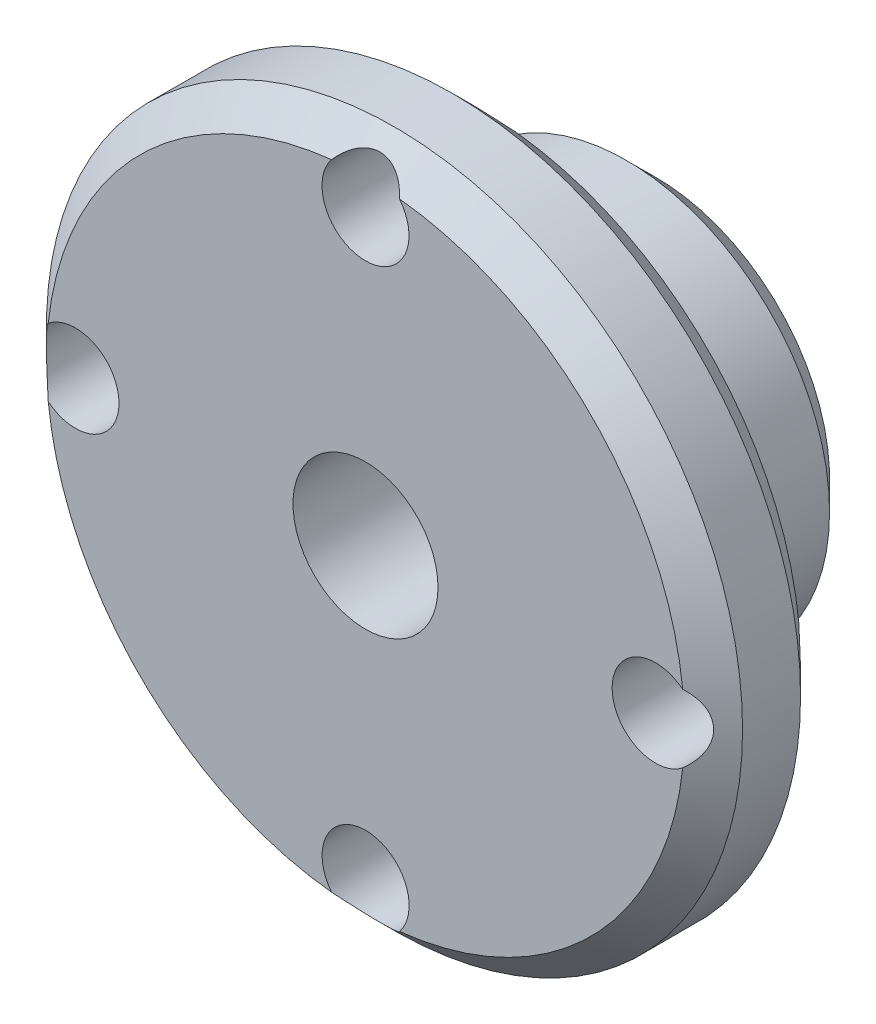
ISO-10303-21;
HEADER;
FILE_DESCRIPTION(('STEP AP214'),'2;1');
FILE_NAME('part.step','',(''),(''),'','','');
FILE_SCHEMA(('AUTOMOTIVE_DESIGN { 1 0 10303 214 1 1 1 1 }'));
ENDSEC;
DATA;
#1=APPLICATION_CONTEXT('core data for automotive mechanical design processes');
#2=APPLICATION_PROTOCOL_DEFINITION('international standard','automotive_design',2000,#1);
#3=PRODUCT_CONTEXT('',#1,'mechanical');
#4=PRODUCT('Part','Part','',(#3));
#5=PRODUCT_RELATED_PRODUCT_CATEGORY('part','',(#4));
#6=PRODUCT_DEFINITION_FORMATION('','',#4);
#7=PRODUCT_DEFINITION_CONTEXT('part definition',#1,'design');
#8=PRODUCT_DEFINITION('design','',#6,#7);
#9=PRODUCT_DEFINITION_SHAPE('','',#8);
#10=(LENGTH_UNIT() NAMED_UNIT(*) SI_UNIT(.MILLI.,.METRE.));
#11=(NAMED_UNIT(*) PLANE_ANGLE_UNIT() SI_UNIT($,.RADIAN.));
#12=(NAMED_UNIT(*) SI_UNIT($,.STERADIAN.) SOLID_ANGLE_UNIT());
#13=UNCERTAINTY_MEASURE_WITH_UNIT(LENGTH_MEASURE(1.E-05),#10,'distance_accuracy_value','');
#14=(GEOMETRIC_REPRESENTATION_CONTEXT(3) GLOBAL_UNCERTAINTY_ASSIGNED_CONTEXT((#13)) GLOBAL_UNIT_ASSIGNED_CONTEXT((#10,
#11,#12)) REPRESENTATION_CONTEXT('',''));
#15=CARTESIAN_POINT('',(0.,0.,0.));
#16=DIRECTION('',(0.,0.,1.));
#17=DIRECTION('',(1.,0.,0.));
#18=AXIS2_PLACEMENT_3D('',#15,#16,#17);
#19=CARTESIAN_POINT('',(0.,0.,2.));
#20=DIRECTION('',(0.,0.,-1.));
#21=DIRECTION('',(-1.,0.,0.));
#22=AXIS2_PLACEMENT_3D('',#19,#20,#21);
#23=CYLINDRICAL_SURFACE('',#22,6.);
#24=CARTESIAN_POINT('',(0.,0.,1.5));
#25=DIRECTION('',(0.,0.,1.));
#26=DIRECTION('',(1.,0.,0.));
#27=AXIS2_PLACEMENT_3D('',#24,#25,#26);
#28=CIRCLE('',#27,6.);
#29=CARTESIAN_POINT('',(6.,0.,1.5));
#30=VERTEX_POINT('',#29);
#31=EDGE_CURVE('E140',#30,#30,#28,.F.);
#32=ORIENTED_EDGE('',*,*,#31,.T.);
#33=EDGE_LOOP('',(#32));
#34=FACE_BOUND('',#33,.T.);
#35=CARTESIAN_POINT('',(0.,0.,0.500000000000009));
#36=DIRECTION('',(0.,0.,1.));
#37=DIRECTION('',(1.,0.,0.));
#38=AXIS2_PLACEMENT_3D('',#35,#36,#37);
#39=CIRCLE('',#38,6.);
#40=CARTESIAN_POINT('',(6.,0.,0.500000000000009));
#41=VERTEX_POINT('',#40);
#42=EDGE_CURVE('E135',#41,#41,#39,.T.);
#43=ORIENTED_EDGE('',*,*,#42,.T.);
#44=EDGE_LOOP('',(#43));
#45=FACE_BOUND('',#44,.T.);
#46=ADVANCED_FACE('F41',(#34,#45),#23,.T.);
#47=CARTESIAN_POINT('',(0.,0.,2.));
#48=DIRECTION('',(0.,0.,1.));
#49=DIRECTION('',(1.,0.,0.));
#50=AXIS2_PLACEMENT_3D('',#47,#48,#49);
#51=PLANE('',#50);
#52=CARTESIAN_POINT('',(0.,0.,2.));
#53=DIRECTION('',(0.,0.,1.));
#54=DIRECTION('',(1.,0.,0.));
#55=AXIS2_PLACEMENT_3D('',#52,#53,#54);
#56=CIRCLE('',#55,1.25);
#57=CARTESIAN_POINT('',(1.25,0.,2.));
#58=VERTEX_POINT('',#57);
#59=EDGE_CURVE('E334',#58,#58,#56,.T.);
#60=ORIENTED_EDGE('',*,*,#59,.F.);
#61=EDGE_LOOP('',(#60));
#62=FACE_BOUND('',#61,.T.);
#63=CARTESIAN_POINT('',(0.,5.,2.));
#64=DIRECTION('',(0.,0.,1.));
#65=DIRECTION('',(1.,0.,0.));
#66=AXIS2_PLACEMENT_3D('',#63,#64,#65);
#67=CIRCLE('',#66,0.75);
#68=CARTESIAN_POINT('',(-0.585468562349857,5.46874999999999,2.));
#69=VERTEX_POINT('',#68);
#70=CARTESIAN_POINT('',(0.585468562349857,5.46874999999999,2.));
#71=VERTEX_POINT('',#70);
#72=EDGE_CURVE('E115',#69,#71,#67,.T.);
#73=ORIENTED_EDGE('',*,*,#72,.F.);
#74=CARTESIAN_POINT('',(0.,0.,2.));
#75=DIRECTION('',(0.,0.,1.));
#76=DIRECTION('',(1.,0.,0.));
#77=AXIS2_PLACEMENT_3D('',#74,#75,#76);
#78=CIRCLE('',#77,5.49999999999999);
#79=CARTESIAN_POINT('',(-5.46896069157344,0.583497175678216,2.));
#80=VERTEX_POINT('',#79);
#81=EDGE_CURVE('E133',#69,#80,#78,.T.);
#82=ORIENTED_EDGE('',*,*,#81,.T.);
#83=CARTESIAN_POINT('',(-4.999,-0.00100000000000092,2.));
#84=DIRECTION('',(0.,0.,1.));
#85=DIRECTION('',(1.,0.,0.));
#86=AXIS2_PLACEMENT_3D('',#83,#84,#85);
#87=CIRCLE('',#86,0.75);
#88=CARTESIAN_POINT('',(-5.4687268083315,-0.585685150773218,2.));
#89=VERTEX_POINT('',#88);
#90=EDGE_CURVE('E325',#89,#80,#87,.T.);
#91=ORIENTED_EDGE('',*,*,#90,.F.);
#92=CARTESIAN_POINT('',(0.,0.,2.));
#93=DIRECTION('',(0.,0.,1.));
#94=DIRECTION('',(1.,0.,0.));
#95=AXIS2_PLACEMENT_3D('',#92,#93,#94);
#96=CIRCLE('',#95,5.49999999999999);
#97=CARTESIAN_POINT('',(-0.583281365982388,-5.46898371254638,2.));
#98=VERTEX_POINT('',#97);
#99=EDGE_CURVE('E319',#89,#98,#96,.T.);
#100=ORIENTED_EDGE('',*,*,#99,.T.);
#101=CARTESIAN_POINT('',(0.00200000000000061,-5.,2.));
#102=DIRECTION('',(0.,0.,1.));
#103=DIRECTION('',(1.,0.,0.));
#104=AXIS2_PLACEMENT_3D('',#101,#102,#103);
#105=CIRCLE('',#104,0.75);
#106=CARTESIAN_POINT('',(0.587656365602389,-5.46851533745375,2.));
#107=VERTEX_POINT('',#106);
#108=EDGE_CURVE('E328',#107,#98,#105,.T.);
#109=ORIENTED_EDGE('',*,*,#108,.F.);
#110=CARTESIAN_POINT('',(0.,0.,2.));
#111=DIRECTION('',(0.,0.,1.));
#112=DIRECTION('',(1.,0.,0.));
#113=AXIS2_PLACEMENT_3D('',#110,#111,#112);
#114=CIRCLE('',#113,5.49999999999999);
#115=CARTESIAN_POINT('',(5.46877349511244,-0.585249057372621,2.));
#116=VERTEX_POINT('',#115);
#117=EDGE_CURVE('E123',#107,#116,#114,.T.);
#118=ORIENTED_EDGE('',*,*,#117,.T.);
#119=CARTESIAN_POINT('',(5.001,0.00100000000000031,2.));
#120=DIRECTION('',(0.,0.,1.));
#121=DIRECTION('',(1.,0.,0.));
#122=AXIS2_PLACEMENT_3D('',#119,#120,#121);
#123=CIRCLE('',#122,0.749999999999998);
#124=CARTESIAN_POINT('',(5.4685390049825,0.587436082467621,2.));
#125=VERTEX_POINT('',#124);
#126=EDGE_CURVE('E118',#125,#116,#123,.T.);
#127=ORIENTED_EDGE('',*,*,#126,.F.);
#128=CARTESIAN_POINT('',(0.,0.,2.));
#129=DIRECTION('',(0.,0.,1.));
#130=DIRECTION('',(1.,0.,0.));
#131=AXIS2_PLACEMENT_3D('',#128,#129,#130);
#132=CIRCLE('',#131,5.49999999999999);
#133=EDGE_CURVE('E111',#125,#71,#132,.T.);
#134=ORIENTED_EDGE('',*,*,#133,.T.);
#135=EDGE_LOOP('',(#73,#82,#91,#100,#109,#118,#127,#134));
#136=FACE_BOUND('',#135,.T.);
#137=ADVANCED_FACE('F113',(#62,#136),#51,.T.);
#138=CARTESIAN_POINT('',(0.,0.,0.));
#139=DIRECTION('',(0.,0.,1.));
#140=DIRECTION('',(1.,0.,0.));
#141=AXIS2_PLACEMENT_3D('',#138,#139,#140);
#142=PLANE('',#141);
#143=CARTESIAN_POINT('',(0.00200000000000061,-5.,0.));
#144=DIRECTION('',(0.,0.,1.));
#145=DIRECTION('',(1.,0.,0.));
#146=AXIS2_PLACEMENT_3D('',#143,#144,#145);
#147=CIRCLE('',#146,0.75);
#148=CARTESIAN_POINT('',(0.587656365602385,-5.46851533745376,0.));
#149=VERTEX_POINT('',#148);
#150=CARTESIAN_POINT('',(-0.583281365982384,-5.46898371254639,0.));
#151=VERTEX_POINT('',#150);
#152=EDGE_CURVE('E308',#149,#151,#147,.T.);
#153=ORIENTED_EDGE('',*,*,#152,.T.);
#154=CARTESIAN_POINT('',(0.,0.,0.));
#155=DIRECTION('',(0.,0.,1.));
#156=DIRECTION('',(1.,0.,0.));
#157=AXIS2_PLACEMENT_3D('',#154,#155,#156);
#158=CIRCLE('',#157,5.5);
#159=CARTESIAN_POINT('',(-5.46872680833151,-0.585685150773214,0.));
#160=VERTEX_POINT('',#159);
#161=EDGE_CURVE('E277',#151,#160,#158,.F.);
#162=ORIENTED_EDGE('',*,*,#161,.T.);
#163=CARTESIAN_POINT('',(-4.999,-0.00100000000000092,0.));
#164=DIRECTION('',(0.,0.,1.));
#165=DIRECTION('',(1.,0.,0.));
#166=AXIS2_PLACEMENT_3D('',#163,#164,#165);
#167=CIRCLE('',#166,0.75);
#168=CARTESIAN_POINT('',(-5.46896069157345,0.583497175678212,0.));
#169=VERTEX_POINT('',#168);
#170=EDGE_CURVE('E130',#160,#169,#167,.T.);
#171=ORIENTED_EDGE('',*,*,#170,.T.);
#172=CARTESIAN_POINT('',(0.,0.,0.));
#173=DIRECTION('',(0.,0.,1.));
#174=DIRECTION('',(1.,0.,0.));
#175=AXIS2_PLACEMENT_3D('',#172,#173,#174);
#176=CIRCLE('',#175,5.5);
#177=CARTESIAN_POINT('',(-0.585468562349852,5.46875,0.));
#178=VERTEX_POINT('',#177);
#179=EDGE_CURVE('E59',#169,#178,#176,.F.);
#180=ORIENTED_EDGE('',*,*,#179,.T.);
#181=CARTESIAN_POINT('',(0.,5.,0.));
#182=DIRECTION('',(0.,0.,1.));
#183=DIRECTION('',(1.,0.,0.));
#184=AXIS2_PLACEMENT_3D('',#181,#182,#183);
#185=CIRCLE('',#184,0.75);
#186=CARTESIAN_POINT('',(0.585468562349852,5.46875,0.));
#187=VERTEX_POINT('',#186);
#188=EDGE_CURVE('E315',#178,#187,#185,.T.);
#189=ORIENTED_EDGE('',*,*,#188,.T.);
#190=CARTESIAN_POINT('',(0.,0.,0.));
#191=DIRECTION('',(0.,0.,1.));
#192=DIRECTION('',(1.,0.,0.));
#193=AXIS2_PLACEMENT_3D('',#190,#191,#192);
#194=CIRCLE('',#193,5.5);
#195=CARTESIAN_POINT('',(5.46853900498251,0.587436082467617,0.));
#196=VERTEX_POINT('',#195);
#197=EDGE_CURVE('E270',#187,#196,#194,.F.);
#198=ORIENTED_EDGE('',*,*,#197,.T.);
#199=CARTESIAN_POINT('',(5.001,0.00100000000000031,0.));
#200=DIRECTION('',(0.,0.,1.));
#201=DIRECTION('',(1.,0.,0.));
#202=AXIS2_PLACEMENT_3D('',#199,#200,#201);
#203=CIRCLE('',#202,0.749999999999998);
#204=CARTESIAN_POINT('',(5.46877349511245,-0.585249057372616,0.));
#205=VERTEX_POINT('',#204);
#206=EDGE_CURVE('E312',#196,#205,#203,.T.);
#207=ORIENTED_EDGE('',*,*,#206,.T.);
#208=CARTESIAN_POINT('',(0.,0.,0.));
#209=DIRECTION('',(0.,0.,1.));
#210=DIRECTION('',(1.,0.,0.));
#211=AXIS2_PLACEMENT_3D('',#208,#209,#210);
#212=CIRCLE('',#211,5.5);
#213=EDGE_CURVE('E268',#205,#149,#212,.F.);
#214=ORIENTED_EDGE('',*,*,#213,.T.);
#215=EDGE_LOOP('',(#153,#162,#171,#180,#189,#198,#207,#214));
#216=FACE_BOUND('',#215,.T.);
#217=CARTESIAN_POINT('',(0.,0.,0.));
#218=DIRECTION('',(0.,0.,1.));
#219=DIRECTION('',(1.,0.,0.));
#220=AXIS2_PLACEMENT_3D('',#217,#218,#219);
#221=CIRCLE('',#220,3.5);
#222=CARTESIAN_POINT('',(3.5,0.,0.));
#223=VERTEX_POINT('',#222);
#224=EDGE_CURVE('E124',#223,#223,#221,.F.);
#225=ORIENTED_EDGE('',*,*,#224,.F.);
#226=EDGE_LOOP('',(#225));
#227=FACE_BOUND('',#226,.T.);
#228=ADVANCED_FACE('F248',(#216,#227),#142,.F.);
#229=CARTESIAN_POINT('',(0.,0.,-3.));
#230=DIRECTION('',(0.,0.,-1.));
#231=DIRECTION('',(-1.,0.,0.));
#232=AXIS2_PLACEMENT_3D('',#229,#230,#231);
#233=PLANE('',#232);
#234=CARTESIAN_POINT('',(0.,0.,-3.));
#235=DIRECTION('',(0.,0.,-1.));
#236=DIRECTION('',(-1.,0.,0.));
#237=AXIS2_PLACEMENT_3D('',#234,#235,#236);
#238=CIRCLE('',#237,3.);
#239=CARTESIAN_POINT('',(-3.,0.,-3.));
#240=VERTEX_POINT('',#239);
#241=EDGE_CURVE('E52',#240,#240,#238,.T.);
#242=ORIENTED_EDGE('',*,*,#241,.T.);
#243=EDGE_LOOP('',(#242));
#244=FACE_BOUND('',#243,.T.);
#245=CARTESIAN_POINT('',(0.,0.,-3.));
#246=DIRECTION('',(0.,0.,-1.));
#247=DIRECTION('',(-1.,0.,0.));
#248=AXIS2_PLACEMENT_3D('',#245,#246,#247);
#249=CIRCLE('',#248,2.5);
#250=CARTESIAN_POINT('',(-2.5,0.,-3.));
#251=VERTEX_POINT('',#250);
#252=EDGE_CURVE('E298',#251,#251,#249,.T.);
#253=ORIENTED_EDGE('',*,*,#252,.F.);
#254=EDGE_LOOP('',(#253));
#255=FACE_BOUND('',#254,.T.);
#256=ADVANCED_FACE('F245',(#244,#255),#233,.T.);
#257=CARTESIAN_POINT('',(0.,0.,-3.));
#258=DIRECTION('',(0.,0.,1.));
#259=DIRECTION('',(1.,0.,0.));
#260=AXIS2_PLACEMENT_3D('',#257,#258,#259);
#261=CYLINDRICAL_SURFACE('',#260,3.5);
#262=CARTESIAN_POINT('',(0.,0.,-2.5));
#263=DIRECTION('',(0.,0.,-1.));
#264=DIRECTION('',(-1.,0.,0.));
#265=AXIS2_PLACEMENT_3D('',#262,#263,#264);
#266=CIRCLE('',#265,3.5);
#267=CARTESIAN_POINT('',(-3.5,0.,-2.5));
#268=VERTEX_POINT('',#267);
#269=EDGE_CURVE('E11',#268,#268,#266,.F.);
#270=ORIENTED_EDGE('',*,*,#269,.T.);
#271=EDGE_LOOP('',(#270));
#272=FACE_BOUND('',#271,.T.);
#273=ORIENTED_EDGE('',*,*,#224,.T.);
#274=EDGE_LOOP('',(#273));
#275=FACE_BOUND('',#274,.T.);
#276=ADVANCED_FACE('F243',(#272,#275),#261,.T.);
#277=CARTESIAN_POINT('',(0.,0.,-3.));
#278=DIRECTION('',(0.,0.,1.));
#279=DIRECTION('',(1.,0.,0.));
#280=AXIS2_PLACEMENT_3D('',#277,#278,#279);
#281=CYLINDRICAL_SURFACE('',#280,2.5);
#282=ORIENTED_EDGE('',*,*,#252,.T.);
#283=EDGE_LOOP('',(#282));
#284=FACE_BOUND('',#283,.T.);
#285=CARTESIAN_POINT('',(0.,0.,0.));
#286=DIRECTION('',(0.,0.,-1.));
#287=DIRECTION('',(-1.,0.,0.));
#288=AXIS2_PLACEMENT_3D('',#285,#286,#287);
#289=CIRCLE('',#288,2.5);
#290=CARTESIAN_POINT('',(-2.5,0.,0.));
#291=VERTEX_POINT('',#290);
#292=EDGE_CURVE('E302',#291,#291,#289,.T.);
#293=ORIENTED_EDGE('',*,*,#292,.F.);
#294=EDGE_LOOP('',(#293));
#295=FACE_BOUND('',#294,.T.);
#296=ADVANCED_FACE('F239',(#284,#295),#281,.F.);
#297=CARTESIAN_POINT('',(0.,0.,0.));
#298=DIRECTION('',(0.,0.,1.));
#299=DIRECTION('',(1.,0.,0.));
#300=AXIS2_PLACEMENT_3D('',#297,#298,#299);
#301=CIRCLE('',#300,1.25);
#302=CARTESIAN_POINT('',(1.25,0.,0.));
#303=VERTEX_POINT('',#302);
#304=EDGE_CURVE('E46',#303,#303,#301,.T.);
#305=ORIENTED_EDGE('',*,*,#304,.T.);
#306=EDGE_LOOP('',(#305));
#307=FACE_BOUND('',#306,.T.);
#308=ORIENTED_EDGE('',*,*,#292,.T.);
#309=EDGE_LOOP('',(#308));
#310=FACE_BOUND('',#309,.T.);
#311=ADVANCED_FACE('F237',(#307,#310),#142,.F.);
#312=CARTESIAN_POINT('',(-4.999,-0.00100000000000092,-0.5));
#313=DIRECTION('',(0.,0.,1.));
#314=DIRECTION('',(1.,0.,0.));
#315=AXIS2_PLACEMENT_3D('',#312,#313,#314);
#316=CYLINDRICAL_SURFACE('',#315,0.75);
#317=ORIENTED_EDGE('',*,*,#90,.T.);
#318=CARTESIAN_POINT('',(-5.46896069157344,0.583497175678217,2.));
#319=CARTESIAN_POINT('',(-5.49813523976206,0.560055866293659,1.97347212423594));
#320=CARTESIAN_POINT('',(-5.52632403204126,0.533773451639623,1.94804512230684));
#321=CARTESIAN_POINT('',(-5.57963483606504,0.475377972943608,1.90024161593699));
#322=CARTESIAN_POINT('',(-5.60473095774736,0.443220636313701,1.87789070220826));
#323=CARTESIAN_POINT('',(-5.64587236280918,0.380036987407392,1.84142776428044));
#324=CARTESIAN_POINT('',(-5.66272980915366,0.349987413694403,1.82655808838139));
#325=CARTESIAN_POINT('',(-5.69252038668611,0.286661100317775,1.80035841040929));
#326=CARTESIAN_POINT('',(-5.70546458904823,0.253393823285079,1.7890184195651));
#327=CARTESIAN_POINT('',(-5.72674391670884,0.183976212467005,1.77040974897053));
#328=CARTESIAN_POINT('',(-5.7350391008631,0.14780385848315,1.76317634348414));
#329=CARTESIAN_POINT('',(-5.74617294469064,0.073986287164703,1.75346957768339));
#330=CARTESIAN_POINT('',(-5.74901244326423,0.0363412971803144,1.75099548554719));
#331=CARTESIAN_POINT('',(-5.74898903291236,-0.0341396487115576,1.75100377470086));
#332=CARTESIAN_POINT('',(-5.74680467947558,-0.0669790346449679,1.7528964598955));
#333=CARTESIAN_POINT('',(-5.73824934907375,-0.131668661613688,1.76033171571431));
#334=CARTESIAN_POINT('',(-5.73187949430698,-0.163519165387272,1.76587330801033));
#335=CARTESIAN_POINT('',(-5.715454494151,-0.225044035969612,1.78019999798305));
#336=CARTESIAN_POINT('',(-5.70544420575685,-0.254739825395197,1.78894562522744));
#337=CARTESIAN_POINT('',(-5.68225273837935,-0.311832938776229,1.80927177792872));
#338=CARTESIAN_POINT('',(-5.66906914620723,-0.339228491991636,1.82085446098795));
#339=CARTESIAN_POINT('',(-5.63453054441123,-0.401377851922976,1.85131445244515));
#340=CARTESIAN_POINT('',(-5.61197965905399,-0.434932027085068,1.87128664085739));
#341=CARTESIAN_POINT('',(-5.56325022538985,-0.496653797139724,1.91472142454721));
#342=CARTESIAN_POINT('',(-5.53706966303735,-0.524818380643924,1.93818595820261));
#343=CARTESIAN_POINT('',(-5.49627445326811,-0.562738398443341,1.9750090721431));
#344=CARTESIAN_POINT('',(-5.48261748274028,-0.574524941218416,1.98737588339054));
#345=CARTESIAN_POINT('',(-5.46872680833151,-0.585685150773223,2.));
#346=B_SPLINE_CURVE_WITH_KNOTS('',3,(#318,#319,#320,#321,#322,#323,#324,#325,#326,#327,#328,
#329,#330,#331,#332,#333,#334,#335,#336,#337,#338,#339,#340,#341,#342,#343,#344,#345),
.UNSPECIFIED.,.F.,.F.,(4,2,2,2,2,2,2,2,2,2,2,2,2,4),(0.,0.137812042013505,0.276709001346447,
0.388833373901599,0.500637494884642,0.613387986210475,0.726121138928019,0.824533831482315,
0.922920148817424,1.02013310483008,1.11742022283566,1.25196271149929,1.38658015652701,
1.4521293583338),.UNSPECIFIED.);
#347=EDGE_CURVE('E199',#80,#89,#346,.T.);
#348=ORIENTED_EDGE('',*,*,#347,.T.);
#349=EDGE_LOOP('',(#317,#348));
#350=FACE_BOUND('',#349,.T.);
#351=ORIENTED_EDGE('',*,*,#170,.F.);
#352=CARTESIAN_POINT('',(-5.46872680833151,-0.585685150773214,0.));
#353=CARTESIAN_POINT('',(-5.49791073258428,-0.56225551541795,0.0265278757640543));
#354=CARTESIAN_POINT('',(-5.52611003767593,-0.535984380639364,0.0519548776931643));
#355=CARTESIAN_POINT('',(-5.57944420029626,-0.477610235203329,0.0997583840630121));
#356=CARTESIAN_POINT('',(-5.60455318547733,-0.445462941603401,0.122109297791739));
#357=CARTESIAN_POINT('',(-5.64571986576077,-0.382295757607144,0.158572235719565));
#358=CARTESIAN_POINT('',(-5.66258933298957,-0.352252930626215,0.173441911618606));
#359=CARTESIAN_POINT('',(-5.69240524372927,-0.288938540931979,0.199641589590713));
#360=CARTESIAN_POINT('',(-5.70536275462763,-0.255676445278211,0.210981580434903));
#361=CARTESIAN_POINT('',(-5.72666985318295,-0.186267353449179,0.229590251029466));
#362=CARTESIAN_POINT('',(-5.73497950850871,-0.150098321097547,0.236823656515859));
#363=CARTESIAN_POINT('',(-5.74614288437912,-0.0762852101151067,0.246530422316612));
#364=CARTESIAN_POINT('',(-5.74899744373305,-0.0386413591701116,0.249004514452814));
#365=CARTESIAN_POINT('',(-5.74900223139989,0.031839590447042,0.248996225299137));
#366=CARTESIAN_POINT('',(-5.74683101651945,0.0646798476683729,0.247103540104502));
#367=CARTESIAN_POINT('',(-5.73830156782828,0.129372892276439,0.239668284285695));
#368=CARTESIAN_POINT('',(-5.73194445632085,0.161225941952457,0.234126691989668));
#369=CARTESIAN_POINT('',(-5.71554407234962,0.222757378924901,0.219800002016951));
#370=CARTESIAN_POINT('',(-5.70554566544804,0.252457170890052,0.211054374772559));
#371=CARTESIAN_POINT('',(-5.68237704173941,0.309559558144076,0.190728222071278));
#372=CARTESIAN_POINT('',(-5.66920441103532,0.336960383658518,0.179145539012048));
#373=CARTESIAN_POINT('',(-5.63469067671944,0.399123556819725,0.148685547554845));
#374=CARTESIAN_POINT('',(-5.6121532175214,0.432686751454624,0.128713359142612));
#375=CARTESIAN_POINT('',(-5.56344848140293,0.494428012241382,0.0852785754527886));
#376=CARTESIAN_POINT('',(-5.53727918923228,0.522603067810899,0.0618140417973851));
#377=CARTESIAN_POINT('',(-5.49649915376868,0.560539403923025,0.0249909278568973));
#378=CARTESIAN_POINT('',(-5.48284689989388,0.572331409635567,0.0126241166094625));
#379=CARTESIAN_POINT('',(-5.46896069157345,0.583497175678217,0.));
#380=B_SPLINE_CURVE_WITH_KNOTS('',3,(#352,#353,#354,#355,#356,#357,#358,#359,#360,#361,#362,
#363,#364,#365,#366,#367,#368,#369,#370,#371,#372,#373,#374,#375,#376,#377,#378,#379),
.UNSPECIFIED.,.F.,.F.,(4,2,2,2,2,2,2,2,2,2,2,2,2,4),(0.,0.137812042013504,0.276709001346445,
0.388833373901596,0.500637494884638,0.613387986210471,0.726121138928014,0.824533831482309,
0.922920148817417,1.02013310483007,1.11742022283565,1.25196271149928,1.386580156527,
1.45212935833379),.UNSPECIFIED.);
#381=EDGE_CURVE('E224',#160,#169,#380,.T.);
#382=ORIENTED_EDGE('',*,*,#381,.T.);
#383=EDGE_LOOP('',(#351,#382));
#384=FACE_BOUND('',#383,.T.);
#385=ADVANCED_FACE('F233',(#350,#384),#316,.F.);
#386=CARTESIAN_POINT('',(0.00200000000000061,-5.,-0.5));
#387=DIRECTION('',(0.,0.,1.));
#388=DIRECTION('',(1.,0.,0.));
#389=AXIS2_PLACEMENT_3D('',#386,#387,#388);
#390=CYLINDRICAL_SURFACE('',#389,0.75);
#391=ORIENTED_EDGE('',*,*,#108,.T.);
#392=CARTESIAN_POINT('',(-0.583281365982388,-5.46898371254638,2.));
#393=CARTESIAN_POINT('',(-0.559861842850771,-5.49823082991975,1.97339653558816));
#394=CARTESIAN_POINT('',(-0.53359371639693,-5.52649431042915,1.94789288943749));
#395=CARTESIAN_POINT('',(-0.475208295516312,-5.57995593389168,1.899936101339));
#396=CARTESIAN_POINT('',(-0.443046497924076,-5.60512813931582,1.8775086082033));
#397=CARTESIAN_POINT('',(-0.379859882677926,-5.64638762789034,1.84092549057404));
#398=CARTESIAN_POINT('',(-0.349818808290455,-5.66329036623299,1.82600897871863));
#399=CARTESIAN_POINT('',(-0.286499261395131,-5.69317297208004,1.7997147706667));
#400=CARTESIAN_POINT('',(-0.253230281783379,-5.70616390750878,1.78832708740856));
#401=CARTESIAN_POINT('',(-0.183795824998775,-5.72753621456721,1.76962369652555));
#402=CARTESIAN_POINT('',(-0.147608140770413,-5.73587748597438,1.76234340608831));
#403=CARTESIAN_POINT('',(-0.0737470806957188,-5.74709757301578,1.75254822108865));
#404=CARTESIAN_POINT('',(-0.0360739456764005,-5.74997727041474,1.75003255728293));
#405=CARTESIAN_POINT('',(0.0344534917571341,-5.7500196227503,1.74997139049168));
#406=CARTESIAN_POINT('',(0.0673100148696411,-5.74786413405875,1.7518333074522));
#407=CARTESIAN_POINT('',(0.132039927378482,-5.73936093308324,1.75921199064719));
#408=CARTESIAN_POINT('',(0.163913576613288,-5.73301433890466,1.76472778210027));
#409=CARTESIAN_POINT('',(0.225467168250005,-5.71663452042586,1.77900422783914));
#410=CARTESIAN_POINT('',(0.255169672202564,-5.7066487029983,1.78772316713297));
#411=CARTESIAN_POINT('',(0.312279925751162,-5.68350400555447,1.80799790925589));
#412=CARTESIAN_POINT('',(0.339685942926989,-5.67034275858543,1.81955582836614));
#413=CARTESIAN_POINT('',(0.401840352262842,-5.63586711130483,1.84994829954424));
#414=CARTESIAN_POINT('',(0.435393693385007,-5.61335883814335,1.86987587416029));
#415=CARTESIAN_POINT('',(0.497124991494282,-5.56471291601569,1.91322262725754));
#416=CARTESIAN_POINT('',(0.52529962253938,-5.53857303858279,1.93664395026817));
#417=CARTESIAN_POINT('',(0.56378062546011,-5.49725596918552,1.97392790527326));
#418=CARTESIAN_POINT('',(0.576058701035818,-5.48301178453495,1.98682475350991));
#419=CARTESIAN_POINT('',(0.587656365602396,-5.46851533745375,2.));
#420=B_SPLINE_CURVE_WITH_KNOTS('',3,(#392,#393,#394,#395,#396,#397,#398,#399,#400,#401,#402,
#403,#404,#405,#406,#407,#408,#409,#410,#411,#412,#413,#414,#415,#416,#417,#418,#419),
.UNSPECIFIED.,.F.,.F.,(4,2,2,2,2,2,2,2,2,2,2,2,2,4),(0.,0.138049427337773,0.277187771935965,
0.389408521259783,0.501308707225072,0.614159589214158,0.726992250009187,0.825444485962202,
0.923870467379601,1.02105761849111,1.11831743755888,1.25273510423627,1.38723562116601,
1.45556985611542),.UNSPECIFIED.);
#421=EDGE_CURVE('E187',#98,#107,#420,.T.);
#422=ORIENTED_EDGE('',*,*,#421,.T.);
#423=EDGE_LOOP('',(#391,#422));
#424=FACE_BOUND('',#423,.T.);
#425=ORIENTED_EDGE('',*,*,#152,.F.);
#426=CARTESIAN_POINT('',(0.587656365602385,-5.46851533745376,0.));
#427=CARTESIAN_POINT('',(0.564260247655169,-5.49778118108356,0.0266034644118449));
#428=CARTESIAN_POINT('',(0.538014740387917,-5.52606566704644,0.0521071105625078));
#429=CARTESIAN_POINT('',(0.479672107482557,-5.57957398173048,0.100063898661002));
#430=CARTESIAN_POINT('',(0.447530457943212,-5.60477190853348,0.122491391796698));
#431=CARTESIAN_POINT('',(0.384376870502354,-5.64608193318907,0.159074509425957));
#432=CARTESIAN_POINT('',(0.354349327916536,-5.66300869897851,0.173991021281372));
#433=CARTESIAN_POINT('',(0.291053707364317,-5.69294195089254,0.200285229333299));
#434=CARTESIAN_POINT('',(0.257795131145317,-5.70595949734361,0.21167291259144));
#435=CARTESIAN_POINT('',(0.188377794422648,-5.72738734511944,0.230376303474453));
#436=CARTESIAN_POINT('',(0.152196794790401,-5.73575756400015,0.237656593911687));
#437=CARTESIAN_POINT('',(0.0783447344194401,-5.74703673628974,0.24745177891135));
#438=CARTESIAN_POINT('',(0.0406739152130741,-5.74994657127038,0.249967442717071));
#439=CARTESIAN_POINT('',(-0.0298534657698205,-5.75004534553331,0.250028609508322));
#440=CARTESIAN_POINT('',(-0.0627117027589188,-5.7479161427458,0.248166692547798));
#441=CARTESIAN_POINT('',(-0.127448397113883,-5.73946472841304,0.240788009352813));
#442=CARTESIAN_POINT('',(-0.159327113423652,-5.73314363518067,0.235272217899733));
#443=CARTESIAN_POINT('',(-0.220893789215909,-5.71681306480885,0.220995772160856));
#444=CARTESIAN_POINT('',(-0.250604272316332,-5.7068510125761,0.212276832867032));
#445=CARTESIAN_POINT('',(-0.307733023344644,-5.68375201073411,0.192002090744104));
#446=CARTESIAN_POINT('',(-0.335149560746437,-5.6706126927869,0.180444171633864));
#447=CARTESIAN_POINT('',(-0.397331530706293,-5.63618678005802,0.150051700455759));
#448=CARTESIAN_POINT('',(-0.430902867707039,-5.61370535676779,0.130124125839714));
#449=CARTESIAN_POINT('',(-0.492673062793778,-5.5651088352374,0.0867773727424592));
#450=CARTESIAN_POINT('',(-0.520868596721595,-5.5389915058705,0.0633560497318282));
#451=CARTESIAN_POINT('',(-0.559382640978635,-5.4977052344921,0.0260720947267417));
#452=CARTESIAN_POINT('',(-0.571672107971255,-5.48347087685856,0.0131752464900845));
#453=CARTESIAN_POINT('',(-0.58328136598239,-5.46898371254639,0.));
#454=B_SPLINE_CURVE_WITH_KNOTS('',3,(#426,#427,#428,#429,#430,#431,#432,#433,#434,#435,#436,
#437,#438,#439,#440,#441,#442,#443,#444,#445,#446,#447,#448,#449,#450,#451,#452,#453),
.UNSPECIFIED.,.F.,.F.,(4,2,2,2,2,2,2,2,2,2,2,2,2,4),(0.,0.138049427337774,0.277187771935965,
0.389408521259782,0.501308707225069,0.614159589214155,0.726992250009182,0.825444485962197,
0.923870467379594,1.0210576184911,1.11831743755887,1.25273510423627,1.387235621166,
1.4555698561154),.UNSPECIFIED.);
#455=EDGE_CURVE('E193',#149,#151,#454,.T.);
#456=ORIENTED_EDGE('',*,*,#455,.T.);
#457=EDGE_LOOP('',(#425,#456));
#458=FACE_BOUND('',#457,.T.);
#459=ADVANCED_FACE('F169',(#424,#458),#390,.F.);
#460=CARTESIAN_POINT('',(5.001,0.00100000000000031,-0.5));
#461=DIRECTION('',(0.,0.,1.));
#462=DIRECTION('',(1.,0.,0.));
#463=AXIS2_PLACEMENT_3D('',#460,#461,#462);
#464=CYLINDRICAL_SURFACE('',#463,0.749999999999998);
#465=ORIENTED_EDGE('',*,*,#126,.T.);
#466=CARTESIAN_POINT('',(5.46877349511244,-0.585249057372621,2.));
#467=CARTESIAN_POINT('',(5.49810245534785,-0.561863092779663,1.97332100643457));
#468=CARTESIAN_POINT('',(5.52645103925,-0.535620635106356,1.94774077518289));
#469=CARTESIAN_POINT('',(5.58008665868645,-0.477266813815091,1.89963082136313));
#470=CARTESIAN_POINT('',(5.6053477275419,-0.445110706207968,1.87712680531248));
#471=CARTESIAN_POINT('',(5.6467503638931,-0.381937722028142,1.84042366822326));
#472=CARTESIAN_POINT('',(5.66371027588778,-0.351911933334431,1.82546042970861));
#473=CARTESIAN_POINT('',(5.6937099745115,-0.288611189484106,1.79907190517279));
#474=CARTESIAN_POINT('',(5.70676082185359,-0.255345761697859,1.78763663394561));
#475=CARTESIAN_POINT('',(5.72825364434536,-0.185903160660136,1.76883871598913));
#476=CARTESIAN_POINT('',(5.73665536992151,-0.149703577288693,1.7615116286882));
#477=CARTESIAN_POINT('',(5.74799105828644,-0.0758037202123001,1.75162817724356));
#478=CARTESIAN_POINT('',(5.75092594561292,-0.0381037013588344,1.74907100642368));
#479=CARTESIAN_POINT('',(5.75106211553767,0.032470091581269,1.74894051576948));
#480=CARTESIAN_POINT('',(5.74894854492819,0.0653445954397284,1.75077174136985));
#481=CARTESIAN_POINT('',(5.74052319164515,0.1301181481843,1.75809400350401));
#482=CARTESIAN_POINT('',(5.7342125232473,0.162017453622636,1.76358406866356));
#483=CARTESIAN_POINT('',(5.71790229347036,0.223606278964731,1.77781046129978));
#484=CARTESIAN_POINT('',(5.70795269831379,0.253319471294981,1.78650282912594));
#485=CARTESIAN_POINT('',(5.68487735822927,0.310456067771157,1.80672639414143));
#486=CARTESIAN_POINT('',(5.67174929146477,0.337877778228151,1.81825966668622));
#487=CARTESIAN_POINT('',(5.63736108462949,0.400050958581048,1.84858496545781));
#488=CARTESIAN_POINT('',(5.61490859728382,0.433612408148846,1.86846815895058));
#489=CARTESIAN_POINT('',(5.56637041035279,0.495372504875981,1.91172733275514));
#490=CARTESIAN_POINT('',(5.54028226899874,0.523567517482183,1.93510566123505));
#491=CARTESIAN_POINT('',(5.49846102945927,0.562625946350844,1.97284832896798));
#492=CARTESIAN_POINT('',(5.48363582466024,0.575399227417036,1.98627409001586));
#493=CARTESIAN_POINT('',(5.46853900498251,0.58743608246763,1.99999999999999));
#494=B_SPLINE_CURVE_WITH_KNOTS('',3,(#466,#467,#468,#469,#470,#471,#472,#473,#474,#475,#476,
#477,#478,#479,#480,#481,#482,#483,#484,#485,#486,#487,#488,#489,#490,#491,#492,#493),
.UNSPECIFIED.,.F.,.F.,(4,2,2,2,2,2,2,2,2,2,2,2,2,4),(0.,0.138286827526194,0.277666562761617,
0.38998363296487,0.501979832414187,0.614931041925698,0.727863147682599,0.82635511627617,
0.924820946945658,1.02198260396233,1.11921545172582,1.25350903141362,1.38789324362547,
1.45900424032457),.UNSPECIFIED.);
#495=EDGE_CURVE('E142',#116,#125,#494,.T.);
#496=ORIENTED_EDGE('',*,*,#495,.T.);
#497=EDGE_LOOP('',(#465,#496));
#498=FACE_BOUND('',#497,.T.);
#499=ORIENTED_EDGE('',*,*,#206,.F.);
#500=CARTESIAN_POINT('',(5.46853900498251,0.587436082467617,0.));
#501=CARTESIAN_POINT('',(5.49787731538749,0.564061848982566,0.0266789935654314));
#502=CARTESIAN_POINT('',(5.52623639190634,0.53783073057349,0.0522592248171131));
#503=CARTESIAN_POINT('',(5.57989534391386,0.479498363905589,0.100369178636869));
#504=CARTESIAN_POINT('',(5.60516927061979,0.447352361276582,0.122873194687524));
#505=CARTESIAN_POINT('',(5.64659716779994,0.384195939890904,0.159576331776745));
#506=CARTESIAN_POINT('',(5.66356908635179,0.3541769362063,0.174539570291395));
#507=CARTESIAN_POINT('',(5.69359409780996,0.290888194897483,0.200928094827211));
#508=CARTESIAN_POINT('',(5.70665824761829,0.257627989066276,0.212363366054394));
#509=CARTESIAN_POINT('',(5.72817883987633,0.188193988991311,0.231161284010866));
#510=CARTESIAN_POINT('',(5.73659504171799,0.151997768532769,0.238488371311805));
#511=CARTESIAN_POINT('',(5.74796028320727,0.0781024507344919,0.248371822756441));
#512=CARTESIAN_POINT('',(5.75091024729059,0.0404036086159614,0.250928993576319));
#513=CARTESIAN_POINT('',(5.75107464107573,-0.0301701242234196,0.251059484230517));
#514=CARTESIAN_POINT('',(5.74897421780685,-0.0630454707121283,0.249228258630152));
#515=CARTESIAN_POINT('',(5.74057476943678,-0.127822387744172,0.241905996495988));
#516=CARTESIAN_POINT('',(5.73427685871381,-0.159724214394089,0.236415931336444));
#517=CARTESIAN_POINT('',(5.71799126084419,-0.221319557598141,0.222189538700215));
#518=CARTESIAN_POINT('',(5.70805354938316,-0.25103672659438,0.213497170874064));
#519=CARTESIAN_POINT('',(5.68500106121159,-0.308182546791463,0.193273605858566));
#520=CARTESIAN_POINT('',(5.67188396198736,-0.335609505232058,0.181740333313781));
#521=CARTESIAN_POINT('',(5.63752062220032,-0.397796433144768,0.15141503454219));
#522=CARTESIAN_POINT('',(5.61508155854504,-0.431366859227463,0.131531841049422));
#523=CARTESIAN_POINT('',(5.56656807459339,-0.493146362407484,0.0882726672448575));
#524=CARTESIAN_POINT('',(5.54049121107501,-0.521351805928478,0.0648943387649457));
#525=CARTESIAN_POINT('',(5.49868559512677,-0.56042695682383,0.0271516710320202));
#526=CARTESIAN_POINT('',(5.48386549980385,-0.57320616576447,0.0137259099841426));
#527=CARTESIAN_POINT('',(5.46877349511245,-0.585249057372625,0.));
#528=B_SPLINE_CURVE_WITH_KNOTS('',3,(#500,#501,#502,#503,#504,#505,#506,#507,#508,#509,#510,
#511,#512,#513,#514,#515,#516,#517,#518,#519,#520,#521,#522,#523,#524,#525,#526,#527),
.UNSPECIFIED.,.F.,.F.,(4,2,2,2,2,2,2,2,2,2,2,2,2,4),(0.,0.138286827526195,0.277666562761617,
0.38998363296487,0.501979832414185,0.614931041925695,0.727863147682595,0.826355116276165,
0.924820946945652,1.02198260396232,1.11921545172581,1.25350903141361,1.38789324362546,
1.45900424032456),.UNSPECIFIED.);
#529=EDGE_CURVE('E175',#196,#205,#528,.T.);
#530=ORIENTED_EDGE('',*,*,#529,.T.);
#531=EDGE_LOOP('',(#499,#530));
#532=FACE_BOUND('',#531,.T.);
#533=ADVANCED_FACE('F163',(#498,#532),#464,.F.);
#534=CARTESIAN_POINT('',(0.,5.,-0.5));
#535=DIRECTION('',(0.,0.,1.));
#536=DIRECTION('',(1.,0.,0.));
#537=AXIS2_PLACEMENT_3D('',#534,#535,#536);
#538=CYLINDRICAL_SURFACE('',#537,0.75);
#539=ORIENTED_EDGE('',*,*,#72,.T.);
#540=CARTESIAN_POINT('',(0.585468562349857,5.46874999999999,2.));
#541=CARTESIAN_POINT('',(0.562060728863184,5.49800645196227,1.97339656581173));
#542=CARTESIAN_POINT('',(0.535803901904795,5.52628040550401,1.94789295030693));
#543=CARTESIAN_POINT('',(0.477439861999147,5.57976531389561,1.89993622349793));
#544=CARTESIAN_POINT('',(0.445288135609262,5.60495034903512,1.8775087609827));
#545=CARTESIAN_POINT('',(0.382118027069465,5.64623505670821,1.84092569139322));
#546=CARTESIAN_POINT('',(0.352083711419241,5.6631497896358,1.82600919825028));
#547=CARTESIAN_POINT('',(0.288776117509052,5.69305767908689,1.79971502796757));
#548=CARTESIAN_POINT('',(0.25551233655865,5.70606189973881,1.78832736376546));
#549=CARTESIAN_POINT('',(0.186086439240745,5.72746193616919,1.76962401073184));
#550=CARTESIAN_POINT('',(0.149902099857416,5.73581766067284,1.76234373903093));
#551=CARTESIAN_POINT('',(0.076045550175264,5.74706725086737,1.75254858936832));
#552=CARTESIAN_POINT('',(0.0383735810506384,5.74996199820944,1.7500329421783));
#553=CARTESIAN_POINT('',(-0.03215381523677,5.75003252959578,1.74997180314293));
#554=CARTESIAN_POINT('',(-0.0650111908954475,5.74789016952748,1.75183373239532));
#555=CARTESIAN_POINT('',(-0.129744482726212,5.73941283519752,1.75921243818895));
#556=CARTESIAN_POINT('',(-0.161620658290745,5.73307897914668,1.7647282399474));
#557=CARTESIAN_POINT('',(-0.223180784143973,5.71672376045743,1.77900470574563));
#558=CARTESIAN_POINT('',(-0.252887276569008,5.70674981269057,1.78772365569127));
#559=CARTESIAN_POINT('',(-0.310006774735461,5.68362793797177,1.8079984183316));
#560=CARTESIAN_POINT('',(-0.33741804898818,5.670477643356,1.81955634732388));
#561=CARTESIAN_POINT('',(-0.399586238852026,5.63602683051647,1.84994884544032));
#562=CARTESIAN_POINT('',(-0.433148579147932,5.61353196081181,1.86987643785521));
#563=CARTESIAN_POINT('',(-0.494899323029226,5.56491069684346,1.91322322607419));
#564=CARTESIAN_POINT('',(-0.523084401688862,5.53878207286842,1.93664456632573));
#565=CARTESIAN_POINT('',(-0.561581700634607,5.49748060433654,1.97392833742099));
#566=CARTESIAN_POINT('',(-0.573865275507952,5.48324156566172,1.98682497386872));
#567=CARTESIAN_POINT('',(-0.585468562349864,5.46874999999999,2.));
#568=B_SPLINE_CURVE_WITH_KNOTS('',3,(#540,#541,#542,#543,#544,#545,#546,#547,#548,#549,#550,
#551,#552,#553,#554,#555,#556,#557,#558,#559,#560,#561,#562,#563,#564,#565,#566,#567),
.UNSPECIFIED.,.F.,.F.,(4,2,2,2,2,2,2,2,2,2,2,2,2,4),(0.,0.138049332380483,0.277187580423304,
0.389408291207582,0.501308438757164,0.614159280602603,0.726991901607013,0.825444121704707,
0.923870087219329,1.02105724859046,1.11831707851209,1.25273479497082,1.38723535854681,
1.45556848114078),.UNSPECIFIED.);
#569=EDGE_CURVE('E128',#71,#69,#568,.T.);
#570=ORIENTED_EDGE('',*,*,#569,.T.);
#571=EDGE_LOOP('',(#539,#570));
#572=FACE_BOUND('',#571,.T.);
#573=ORIENTED_EDGE('',*,*,#188,.F.);
#574=CARTESIAN_POINT('',(-0.585468562349852,5.46875,0.));
#575=CARTESIAN_POINT('',(-0.562060728863179,5.49800645196227,0.0266034341882742));
#576=CARTESIAN_POINT('',(-0.53580390190479,5.52628040550402,0.0521070496930663));
#577=CARTESIAN_POINT('',(-0.477439861999141,5.57976531389562,0.100063776502067));
#578=CARTESIAN_POINT('',(-0.445288135609257,5.60495034903513,0.122491239017301));
#579=CARTESIAN_POINT('',(-0.38211802706946,5.64623505670821,0.159074308606784));
#580=CARTESIAN_POINT('',(-0.352083711419236,5.6631497896358,0.173990801749723));
#581=CARTESIAN_POINT('',(-0.288776117509047,5.6930576790869,0.20028497203243));
#582=CARTESIAN_POINT('',(-0.255512336558645,5.70606189973881,0.21167263623454));
#583=CARTESIAN_POINT('',(-0.186086439240741,5.72746193616919,0.230375989268165));
#584=CARTESIAN_POINT('',(-0.149902099857411,5.73581766067284,0.237656260969075));
#585=CARTESIAN_POINT('',(-0.0760455501752601,5.74706725086737,0.24745141063168));
#586=CARTESIAN_POINT('',(-0.0383735810506347,5.74996199820944,0.249967057821697));
#587=CARTESIAN_POINT('',(0.0321538152367731,5.75003252959578,0.250028196857068));
#588=CARTESIAN_POINT('',(0.0650111908954503,5.74789016952748,0.248166267604675));
#589=CARTESIAN_POINT('',(0.129744482726214,5.73941283519752,0.240787561811053));
#590=CARTESIAN_POINT('',(0.161620658290746,5.73307897914668,0.235271760052596));
#591=CARTESIAN_POINT('',(0.223180784143974,5.71672376045743,0.220995294254367));
#592=CARTESIAN_POINT('',(0.252887276569009,5.70674981269057,0.212276344308725));
#593=CARTESIAN_POINT('',(0.310006774735461,5.68362793797177,0.192001581668394));
#594=CARTESIAN_POINT('',(0.33741804898818,5.670477643356,0.18044365267612));
#595=CARTESIAN_POINT('',(0.399586238852026,5.63602683051647,0.150051154559681));
#596=CARTESIAN_POINT('',(0.433148579147932,5.61353196081181,0.130123562144785));
#597=CARTESIAN_POINT('',(0.494899323029225,5.56491069684346,0.0867767739258108));
#598=CARTESIAN_POINT('',(0.523084401688862,5.53878207286842,0.0633554336742656));
#599=CARTESIAN_POINT('',(0.561581700634605,5.49748060433654,0.0260716625790091));
#600=CARTESIAN_POINT('',(0.573865275507949,5.48324156566172,0.0131750261312806));
#601=CARTESIAN_POINT('',(0.585468562349859,5.46875,0.));
#602=B_SPLINE_CURVE_WITH_KNOTS('',3,(#574,#575,#576,#577,#578,#579,#580,#581,#582,#583,#584,
#585,#586,#587,#588,#589,#590,#591,#592,#593,#594,#595,#596,#597,#598,#599,#600,#601),
.UNSPECIFIED.,.F.,.F.,(4,2,2,2,2,2,2,2,2,2,2,2,2,4),(0.,0.138049332380483,0.277187580423304,
0.38940829120758,0.501308438757162,0.6141592806026,0.726991901607009,0.825444121704703,
0.923870087219324,1.02105724859046,1.11831707851208,1.25273479497081,1.38723535854681,
1.45556848114076),.UNSPECIFIED.);
#603=EDGE_CURVE('E65',#178,#187,#602,.T.);
#604=ORIENTED_EDGE('',*,*,#603,.T.);
#605=EDGE_LOOP('',(#573,#604));
#606=FACE_BOUND('',#605,.T.);
#607=ADVANCED_FACE('F127',(#572,#606),#538,.F.);
#608=CARTESIAN_POINT('',(0.,0.,2.));
#609=DIRECTION('',(0.,0.,-1.));
#610=DIRECTION('',(-1.,0.,0.));
#611=AXIS2_PLACEMENT_3D('',#608,#609,#610);
#612=CONICAL_SURFACE('',#611,5.49999999999999,0.785398163397454);
#613=ORIENTED_EDGE('',*,*,#31,.F.);
#614=EDGE_LOOP('',(#613));
#615=FACE_BOUND('',#614,.T.);
#616=ORIENTED_EDGE('',*,*,#347,.F.);
#617=ORIENTED_EDGE('',*,*,#81,.F.);
#618=ORIENTED_EDGE('',*,*,#569,.F.);
#619=ORIENTED_EDGE('',*,*,#133,.F.);
#620=ORIENTED_EDGE('',*,*,#495,.F.);
#621=ORIENTED_EDGE('',*,*,#117,.F.);
#622=ORIENTED_EDGE('',*,*,#421,.F.);
#623=ORIENTED_EDGE('',*,*,#99,.F.);
#624=EDGE_LOOP('',(#616,#617,#618,#619,#620,#621,#622,#623));
#625=FACE_BOUND('',#624,.T.);
#626=ADVANCED_FACE('F132',(#615,#625),#612,.T.);
#627=CARTESIAN_POINT('',(0.,0.,0.500000000000009));
#628=DIRECTION('',(0.,0.,1.));
#629=DIRECTION('',(1.,0.,0.));
#630=AXIS2_PLACEMENT_3D('',#627,#628,#629);
#631=CONICAL_SURFACE('',#630,6.,0.785398163397444);
#632=ORIENTED_EDGE('',*,*,#381,.F.);
#633=ORIENTED_EDGE('',*,*,#161,.F.);
#634=ORIENTED_EDGE('',*,*,#455,.F.);
#635=ORIENTED_EDGE('',*,*,#213,.F.);
#636=ORIENTED_EDGE('',*,*,#529,.F.);
#637=ORIENTED_EDGE('',*,*,#197,.F.);
#638=ORIENTED_EDGE('',*,*,#603,.F.);
#639=ORIENTED_EDGE('',*,*,#179,.F.);
#640=EDGE_LOOP('',(#632,#633,#634,#635,#636,#637,#638,#639));
#641=FACE_BOUND('',#640,.T.);
#642=ORIENTED_EDGE('',*,*,#42,.F.);
#643=EDGE_LOOP('',(#642));
#644=FACE_BOUND('',#643,.T.);
#645=ADVANCED_FACE('F216',(#641,#644),#631,.T.);
#646=CARTESIAN_POINT('',(0.,0.,-3.));
#647=DIRECTION('',(0.,0.,1.));
#648=DIRECTION('',(1.,0.,0.));
#649=AXIS2_PLACEMENT_3D('',#646,#647,#648);
#650=CONICAL_SURFACE('',#649,3.,0.785398163397447);
#651=ORIENTED_EDGE('',*,*,#269,.F.);
#652=EDGE_LOOP('',(#651));
#653=FACE_BOUND('',#652,.T.);
#654=ORIENTED_EDGE('',*,*,#241,.F.);
#655=EDGE_LOOP('',(#654));
#656=FACE_BOUND('',#655,.T.);
#657=ADVANCED_FACE('F44',(#653,#656),#650,.T.);
#658=CARTESIAN_POINT('',(0.,0.,-3.));
#659=DIRECTION('',(0.,0.,1.));
#660=DIRECTION('',(1.,0.,0.));
#661=AXIS2_PLACEMENT_3D('',#658,#659,#660);
#662=CYLINDRICAL_SURFACE('',#661,1.25);
#663=ORIENTED_EDGE('',*,*,#59,.T.);
#664=EDGE_LOOP('',(#663));
#665=FACE_BOUND('',#664,.T.);
#666=ORIENTED_EDGE('',*,*,#304,.F.);
#667=EDGE_LOOP('',(#666));
#668=FACE_BOUND('',#667,.T.);
#669=ADVANCED_FACE('F164',(#665,#668),#662,.F.);
#670=CLOSED_SHELL('',(#46,#137,#228,#256,#276,#296,#311,#385,#459,#533,#607,#626,#645,#657,#669));
#671=MANIFOLD_SOLID_BREP('B2',#670);
#672=ADVANCED_BREP_SHAPE_REPRESENTATION('',(#18,#671),#14);
#673=SHAPE_DEFINITION_REPRESENTATION(#9,#672);
ENDSEC;
END-ISO-10303-21;
